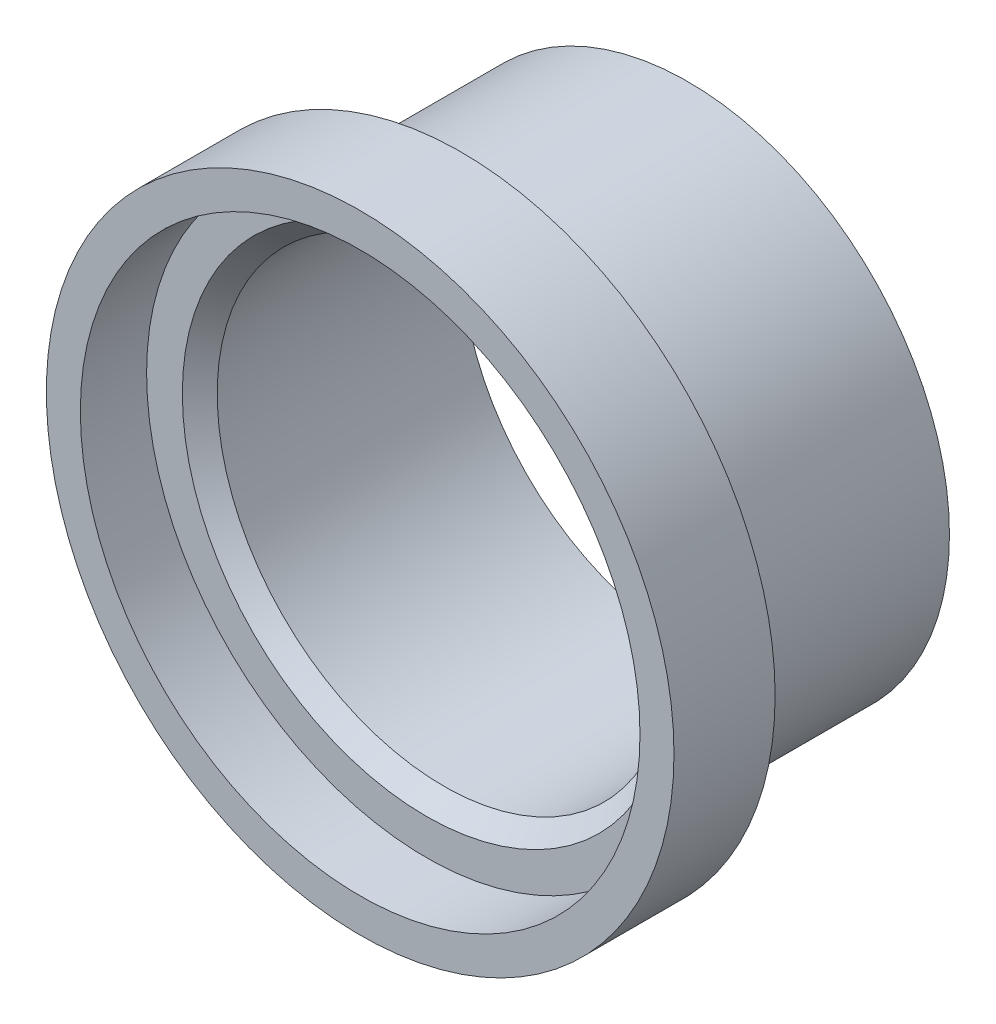
ISO-10303-21;
HEADER;
FILE_DESCRIPTION(('STEP AP214'),'2;1');
FILE_NAME('part.step','',(''),(''),'','','');
FILE_SCHEMA(('AUTOMOTIVE_DESIGN { 1 0 10303 214 1 1 1 1 }'));
ENDSEC;
DATA;
#1=APPLICATION_CONTEXT('core data for automotive mechanical design processes');
#2=APPLICATION_PROTOCOL_DEFINITION('international standard','automotive_design',2000,#1);
#3=PRODUCT_CONTEXT('',#1,'mechanical');
#4=PRODUCT('Part','Part','',(#3));
#5=PRODUCT_RELATED_PRODUCT_CATEGORY('part','',(#4));
#6=PRODUCT_DEFINITION_FORMATION('','',#4);
#7=PRODUCT_DEFINITION_CONTEXT('part definition',#1,'design');
#8=PRODUCT_DEFINITION('design','',#6,#7);
#9=PRODUCT_DEFINITION_SHAPE('','',#8);
#10=(LENGTH_UNIT() NAMED_UNIT(*) SI_UNIT(.MILLI.,.METRE.));
#11=(NAMED_UNIT(*) PLANE_ANGLE_UNIT() SI_UNIT($,.RADIAN.));
#12=(NAMED_UNIT(*) SI_UNIT($,.STERADIAN.) SOLID_ANGLE_UNIT());
#13=UNCERTAINTY_MEASURE_WITH_UNIT(LENGTH_MEASURE(1.E-05),#10,'distance_accuracy_value','');
#14=(GEOMETRIC_REPRESENTATION_CONTEXT(3) GLOBAL_UNCERTAINTY_ASSIGNED_CONTEXT((#13)) GLOBAL_UNIT_ASSIGNED_CONTEXT((#10,
#11,#12)) REPRESENTATION_CONTEXT('',''));
#15=CARTESIAN_POINT('',(0.,0.,0.));
#16=DIRECTION('',(0.,0.,1.));
#17=DIRECTION('',(1.,0.,0.));
#18=AXIS2_PLACEMENT_3D('',#15,#16,#17);
#19=CARTESIAN_POINT('',(0.,0.,15.));
#20=DIRECTION('',(0.,0.,1.));
#21=DIRECTION('',(1.,0.,0.));
#22=AXIS2_PLACEMENT_3D('',#19,#20,#21);
#23=PLANE('',#22);
#24=CARTESIAN_POINT('',(0.,0.,15.));
#25=DIRECTION('',(0.,0.,1.));
#26=DIRECTION('',(1.,0.,0.));
#27=AXIS2_PLACEMENT_3D('',#24,#25,#26);
#28=CIRCLE('',#27,14.);
#29=CARTESIAN_POINT('',(14.,0.,15.));
#30=VERTEX_POINT('',#29);
#31=EDGE_CURVE('E38',#30,#30,#28,.F.);
#32=ORIENTED_EDGE('',*,*,#31,.T.);
#33=EDGE_LOOP('',(#32));
#34=FACE_BOUND('',#33,.T.);
#35=CARTESIAN_POINT('',(0.,0.,15.));
#36=DIRECTION('',(0.,0.,1.));
#37=DIRECTION('',(1.,0.,0.));
#38=AXIS2_PLACEMENT_3D('',#35,#36,#37);
#39=CIRCLE('',#38,16.05);
#40=CARTESIAN_POINT('',(-16.05,0.,15.));
#41=VERTEX_POINT('',#40);
#42=EDGE_CURVE('E10',#41,#41,#39,.F.);
#43=ORIENTED_EDGE('',*,*,#42,.F.);
#44=EDGE_LOOP('',(#43));
#45=FACE_BOUND('',#44,.T.);
#46=ADVANCED_FACE('F31',(#34,#45),#23,.T.);
#47=CARTESIAN_POINT('',(0.,0.,55.4264068711929));
#48=DIRECTION('',(0.,0.,-1.));
#49=DIRECTION('',(-1.,0.,0.));
#50=AXIS2_PLACEMENT_3D('',#47,#48,#49);
#51=CYLINDRICAL_SURFACE('',#50,15.);
#52=CARTESIAN_POINT('',(0.,0.,0.));
#53=DIRECTION('',(0.,0.,1.));
#54=DIRECTION('',(1.,0.,0.));
#55=AXIS2_PLACEMENT_3D('',#52,#53,#54);
#56=CIRCLE('',#55,15.);
#57=CARTESIAN_POINT('',(15.,0.,0.));
#58=VERTEX_POINT('',#57);
#59=EDGE_CURVE('E49',#58,#58,#56,.T.);
#60=ORIENTED_EDGE('',*,*,#59,.T.);
#61=EDGE_LOOP('',(#60));
#62=FACE_BOUND('',#61,.T.);
#63=CARTESIAN_POINT('',(0.,0.,13.));
#64=DIRECTION('',(0.,0.,1.));
#65=DIRECTION('',(1.,0.,0.));
#66=AXIS2_PLACEMENT_3D('',#63,#64,#65);
#67=CIRCLE('',#66,15.);
#68=CARTESIAN_POINT('',(15.,0.,13.));
#69=VERTEX_POINT('',#68);
#70=EDGE_CURVE('E46',#69,#69,#67,.T.);
#71=ORIENTED_EDGE('',*,*,#70,.F.);
#72=EDGE_LOOP('',(#71));
#73=FACE_BOUND('',#72,.T.);
#74=ADVANCED_FACE('F82',(#62,#73),#51,.T.);
#75=CARTESIAN_POINT('',(0.,0.,0.));
#76=DIRECTION('',(0.,0.,1.));
#77=DIRECTION('',(1.,0.,0.));
#78=AXIS2_PLACEMENT_3D('',#75,#76,#77);
#79=PLANE('',#78);
#80=ORIENTED_EDGE('',*,*,#59,.F.);
#81=EDGE_LOOP('',(#80));
#82=FACE_BOUND('',#81,.T.);
#83=CARTESIAN_POINT('',(0.,0.,0.));
#84=DIRECTION('',(0.,0.,1.));
#85=DIRECTION('',(1.,0.,0.));
#86=AXIS2_PLACEMENT_3D('',#83,#84,#85);
#87=CIRCLE('',#86,13.);
#88=CARTESIAN_POINT('',(13.,0.,0.));
#89=VERTEX_POINT('',#88);
#90=EDGE_CURVE('E52',#89,#89,#87,.T.);
#91=ORIENTED_EDGE('',*,*,#90,.T.);
#92=EDGE_LOOP('',(#91));
#93=FACE_BOUND('',#92,.T.);
#94=ADVANCED_FACE('F86',(#82,#93),#79,.F.);
#95=CARTESIAN_POINT('',(0.,0.,55.4264068711929));
#96=DIRECTION('',(0.,0.,-1.));
#97=DIRECTION('',(-1.,0.,0.));
#98=AXIS2_PLACEMENT_3D('',#95,#96,#97);
#99=CYLINDRICAL_SURFACE('',#98,13.);
#100=CARTESIAN_POINT('',(0.,0.,14.));
#101=DIRECTION('',(0.,0.,1.));
#102=DIRECTION('',(1.,0.,0.));
#103=AXIS2_PLACEMENT_3D('',#100,#101,#102);
#104=CIRCLE('',#103,13.);
#105=CARTESIAN_POINT('',(13.,0.,14.));
#106=VERTEX_POINT('',#105);
#107=EDGE_CURVE('E42',#106,#106,#104,.T.);
#108=ORIENTED_EDGE('',*,*,#107,.T.);
#109=EDGE_LOOP('',(#108));
#110=FACE_BOUND('',#109,.T.);
#111=ORIENTED_EDGE('',*,*,#90,.F.);
#112=EDGE_LOOP('',(#111));
#113=FACE_BOUND('',#112,.T.);
#114=ADVANCED_FACE('F93',(#110,#113),#99,.F.);
#115=CARTESIAN_POINT('',(0.,0.,13.));
#116=DIRECTION('',(0.,0.,1.));
#117=DIRECTION('',(1.,0.,0.));
#118=AXIS2_PLACEMENT_3D('',#115,#116,#117);
#119=PLANE('',#118);
#120=ORIENTED_EDGE('',*,*,#70,.T.);
#121=EDGE_LOOP('',(#120));
#122=FACE_BOUND('',#121,.T.);
#123=CARTESIAN_POINT('',(0.,0.,13.));
#124=DIRECTION('',(0.,0.,1.));
#125=DIRECTION('',(1.,0.,0.));
#126=AXIS2_PLACEMENT_3D('',#123,#124,#125);
#127=CIRCLE('',#126,18.);
#128=CARTESIAN_POINT('',(18.,0.,13.));
#129=VERTEX_POINT('',#128);
#130=EDGE_CURVE('E55',#129,#129,#127,.T.);
#131=ORIENTED_EDGE('',*,*,#130,.F.);
#132=EDGE_LOOP('',(#131));
#133=FACE_BOUND('',#132,.T.);
#134=ADVANCED_FACE('F90',(#122,#133),#119,.F.);
#135=CARTESIAN_POINT('',(0.,0.,15.));
#136=DIRECTION('',(0.,0.,-1.));
#137=DIRECTION('',(-1.,0.,0.));
#138=AXIS2_PLACEMENT_3D('',#135,#136,#137);
#139=CYLINDRICAL_SURFACE('',#138,18.);
#140=ORIENTED_EDGE('',*,*,#130,.T.);
#141=EDGE_LOOP('',(#140));
#142=FACE_BOUND('',#141,.T.);
#143=CARTESIAN_POINT('',(0.,0.,18.8));
#144=DIRECTION('',(0.,0.,1.));
#145=DIRECTION('',(1.,0.,0.));
#146=AXIS2_PLACEMENT_3D('',#143,#144,#145);
#147=CIRCLE('',#146,18.);
#148=CARTESIAN_POINT('',(18.,0.,18.8));
#149=VERTEX_POINT('',#148);
#150=EDGE_CURVE('E60',#149,#149,#147,.T.);
#151=ORIENTED_EDGE('',*,*,#150,.F.);
#152=EDGE_LOOP('',(#151));
#153=FACE_BOUND('',#152,.T.);
#154=ADVANCED_FACE('F78',(#142,#153),#139,.T.);
#155=CARTESIAN_POINT('',(0.,0.,14.));
#156=DIRECTION('',(0.,0.,1.));
#157=DIRECTION('',(1.,0.,0.));
#158=AXIS2_PLACEMENT_3D('',#155,#156,#157);
#159=CONICAL_SURFACE('',#158,13.,0.785398163397451);
#160=ORIENTED_EDGE('',*,*,#31,.F.);
#161=EDGE_LOOP('',(#160));
#162=FACE_BOUND('',#161,.T.);
#163=ORIENTED_EDGE('',*,*,#107,.F.);
#164=EDGE_LOOP('',(#163));
#165=FACE_BOUND('',#164,.T.);
#166=ADVANCED_FACE('F33',(#162,#165),#159,.F.);
#167=CARTESIAN_POINT('',(0.,0.,18.8));
#168=DIRECTION('',(0.,0.,1.));
#169=DIRECTION('',(1.,0.,0.));
#170=AXIS2_PLACEMENT_3D('',#167,#168,#169);
#171=PLANE('',#170);
#172=ORIENTED_EDGE('',*,*,#150,.T.);
#173=EDGE_LOOP('',(#172));
#174=FACE_BOUND('',#173,.T.);
#175=CARTESIAN_POINT('',(0.,0.,18.8));
#176=DIRECTION('',(0.,0.,1.));
#177=DIRECTION('',(1.,0.,0.));
#178=AXIS2_PLACEMENT_3D('',#175,#176,#177);
#179=CIRCLE('',#178,16.05);
#180=CARTESIAN_POINT('',(-16.05,0.,18.8));
#181=VERTEX_POINT('',#180);
#182=EDGE_CURVE('E63',#181,#181,#179,.T.);
#183=ORIENTED_EDGE('',*,*,#182,.F.);
#184=EDGE_LOOP('',(#183));
#185=FACE_BOUND('',#184,.T.);
#186=ADVANCED_FACE('F69',(#174,#185),#171,.T.);
#187=CARTESIAN_POINT('',(0.,0.,18.8));
#188=DIRECTION('',(0.,0.,-1.));
#189=DIRECTION('',(-1.,0.,0.));
#190=AXIS2_PLACEMENT_3D('',#187,#188,#189);
#191=CYLINDRICAL_SURFACE('',#190,16.05);
#192=CARTESIAN_POINT('',(-16.05,0.,18.8));
#193=CARTESIAN_POINT('',(-16.05,0.,18.7604166666667));
#194=CARTESIAN_POINT('',(-16.05,0.,18.7208333333333));
#195=CARTESIAN_POINT('',(-16.05,0.,18.6416666666667));
#196=CARTESIAN_POINT('',(-16.05,0.,18.6020833333333));
#197=CARTESIAN_POINT('',(-16.05,0.,18.5229166666667));
#198=CARTESIAN_POINT('',(-16.05,0.,18.4833333333333));
#199=CARTESIAN_POINT('',(-16.05,0.,18.4041666666667));
#200=CARTESIAN_POINT('',(-16.05,0.,18.3645833333333));
#201=CARTESIAN_POINT('',(-16.05,0.,18.2854166666667));
#202=CARTESIAN_POINT('',(-16.05,0.,18.2458333333333));
#203=CARTESIAN_POINT('',(-16.05,0.,18.1666666666667));
#204=CARTESIAN_POINT('',(-16.05,0.,18.1270833333333));
#205=CARTESIAN_POINT('',(-16.05,0.,18.0479166666667));
#206=CARTESIAN_POINT('',(-16.05,0.,18.0083333333333));
#207=CARTESIAN_POINT('',(-16.05,0.,17.9291666666667));
#208=CARTESIAN_POINT('',(-16.05,0.,17.8895833333333));
#209=CARTESIAN_POINT('',(-16.05,0.,17.8104166666667));
#210=CARTESIAN_POINT('',(-16.05,0.,17.7708333333333));
#211=CARTESIAN_POINT('',(-16.05,0.,17.6916666666667));
#212=CARTESIAN_POINT('',(-16.05,0.,17.6520833333333));
#213=CARTESIAN_POINT('',(-16.05,0.,17.5729166666667));
#214=CARTESIAN_POINT('',(-16.05,0.,17.5333333333333));
#215=CARTESIAN_POINT('',(-16.05,0.,17.4541666666667));
#216=CARTESIAN_POINT('',(-16.05,0.,17.4145833333333));
#217=CARTESIAN_POINT('',(-16.05,0.,17.3354166666667));
#218=CARTESIAN_POINT('',(-16.05,0.,17.2958333333333));
#219=CARTESIAN_POINT('',(-16.05,0.,17.2166666666667));
#220=CARTESIAN_POINT('',(-16.05,0.,17.1770833333333));
#221=CARTESIAN_POINT('',(-16.05,0.,17.0979166666667));
#222=CARTESIAN_POINT('',(-16.05,0.,17.0583333333333));
#223=CARTESIAN_POINT('',(-16.05,0.,16.9791666666667));
#224=CARTESIAN_POINT('',(-16.05,0.,16.9395833333333));
#225=CARTESIAN_POINT('',(-16.05,0.,16.8604166666667));
#226=CARTESIAN_POINT('',(-16.05,0.,16.8208333333333));
#227=CARTESIAN_POINT('',(-16.05,0.,16.7416666666667));
#228=CARTESIAN_POINT('',(-16.05,0.,16.7020833333333));
#229=CARTESIAN_POINT('',(-16.05,0.,16.6229166666667));
#230=CARTESIAN_POINT('',(-16.05,0.,16.5833333333333));
#231=CARTESIAN_POINT('',(-16.05,0.,16.5041666666667));
#232=CARTESIAN_POINT('',(-16.05,0.,16.4645833333333));
#233=CARTESIAN_POINT('',(-16.05,0.,16.3854166666667));
#234=CARTESIAN_POINT('',(-16.05,0.,16.3458333333333));
#235=CARTESIAN_POINT('',(-16.05,0.,16.2666666666667));
#236=CARTESIAN_POINT('',(-16.05,0.,16.2270833333333));
#237=CARTESIAN_POINT('',(-16.05,0.,16.1479166666667));
#238=CARTESIAN_POINT('',(-16.05,0.,16.1083333333333));
#239=CARTESIAN_POINT('',(-16.05,0.,16.0291666666667));
#240=CARTESIAN_POINT('',(-16.05,0.,15.9895833333333));
#241=CARTESIAN_POINT('',(-16.05,0.,15.9104166666667));
#242=CARTESIAN_POINT('',(-16.05,0.,15.8708333333333));
#243=CARTESIAN_POINT('',(-16.05,0.,15.7916666666667));
#244=CARTESIAN_POINT('',(-16.05,0.,15.7520833333333));
#245=CARTESIAN_POINT('',(-16.05,0.,15.6729166666667));
#246=CARTESIAN_POINT('',(-16.05,0.,15.6333333333333));
#247=CARTESIAN_POINT('',(-16.05,0.,15.5541666666667));
#248=CARTESIAN_POINT('',(-16.05,0.,15.5145833333333));
#249=CARTESIAN_POINT('',(-16.05,0.,15.4354166666667));
#250=CARTESIAN_POINT('',(-16.05,0.,15.3958333333333));
#251=CARTESIAN_POINT('',(-16.05,0.,15.3166666666667));
#252=CARTESIAN_POINT('',(-16.05,0.,15.2770833333333));
#253=CARTESIAN_POINT('',(-16.05,0.,15.1979166666667));
#254=CARTESIAN_POINT('',(-16.05,0.,15.1583333333333));
#255=CARTESIAN_POINT('',(-16.05,0.,15.0791666666667));
#256=CARTESIAN_POINT('',(-16.05,0.,15.0395833333333));
#257=CARTESIAN_POINT('',(-16.05,0.,15.));
#258=B_SPLINE_CURVE_WITH_KNOTS('',3,(#192,#193,#194,#195,#196,#197,#198,#199,#200,#201,#202,
#203,#204,#205,#206,#207,#208,#209,#210,#211,#212,#213,#214,#215,#216,#217,#218,#219,#220,#221,
#222,#223,#224,#225,#226,#227,#228,#229,#230,#231,#232,#233,#234,#235,#236,#237,#238,#239,#240,
#241,#242,#243,#244,#245,#246,#247,#248,#249,#250,#251,#252,#253,#254,#255,#256,#257),
.UNSPECIFIED.,.F.,.F.,(4,2,2,2,2,2,2,2,2,2,2,2,2,2,2,2,2,2,2,2,2,2,2,2,2,2,2,2,2,2,2,2,4),(0.,
0.118750000000001,0.237500000000002,0.356250000000002,0.475000000000003,0.593750000000001,
0.712500000000001,0.831250000000002,0.950000000000003,1.06875,1.1875,1.30625,1.425,1.54375,
1.6625,1.78125,1.9,2.01875,2.1375,2.25625,2.375,2.49375,2.6125,2.73125,2.85,2.96875,3.0875,
3.20625,3.325,3.44375,3.5625,3.68125,3.8),.UNSPECIFIED.);
#259=EDGE_CURVE('BSEAM67',#181,#41,#258,.T.);
#260=ORIENTED_EDGE('',*,*,#182,.T.);
#261=ORIENTED_EDGE('',*,*,#42,.T.);
#262=ORIENTED_EDGE('',*,*,#259,.T.);
#263=ORIENTED_EDGE('',*,*,#259,.F.);
#264=EDGE_LOOP('',(#260,#262,#261,#263));
#265=FACE_BOUND('',#264,.T.);
#266=ADVANCED_FACE('F67',(#265),#191,.F.);
#267=CLOSED_SHELL('',(#46,#74,#94,#114,#134,#154,#166,#186,#266));
#268=MANIFOLD_SOLID_BREP('B2',#267);
#269=ADVANCED_BREP_SHAPE_REPRESENTATION('',(#18,#268),#14);
#270=SHAPE_DEFINITION_REPRESENTATION(#9,#269);
ENDSEC;
END-ISO-10303-21;
